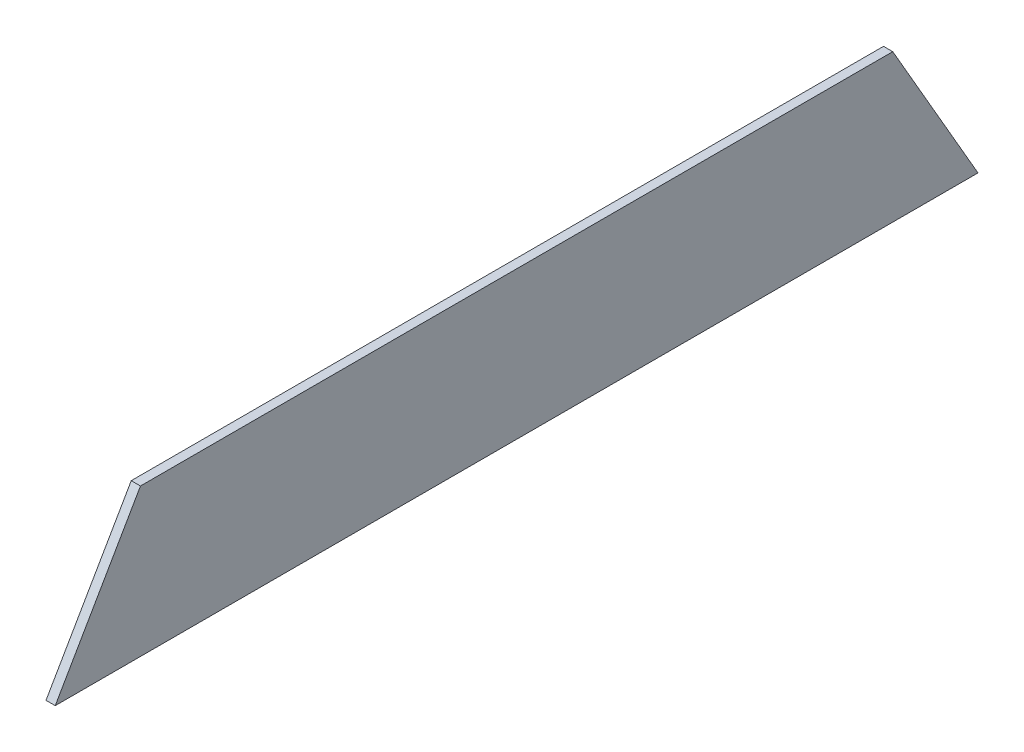
ISO-10303-21;
HEADER;
FILE_DESCRIPTION(('STEP AP214'),'2;1');
FILE_NAME('part.step','',(''),(''),'','','');
FILE_SCHEMA(('AUTOMOTIVE_DESIGN { 1 0 10303 214 1 1 1 1 }'));
ENDSEC;
DATA;
#1=APPLICATION_CONTEXT('core data for automotive mechanical design processes');
#2=APPLICATION_PROTOCOL_DEFINITION('international standard','automotive_design',2000,#1);
#3=PRODUCT_CONTEXT('',#1,'mechanical');
#4=PRODUCT('Part','Part','',(#3));
#5=PRODUCT_RELATED_PRODUCT_CATEGORY('part','',(#4));
#6=PRODUCT_DEFINITION_FORMATION('','',#4);
#7=PRODUCT_DEFINITION_CONTEXT('part definition',#1,'design');
#8=PRODUCT_DEFINITION('design','',#6,#7);
#9=PRODUCT_DEFINITION_SHAPE('','',#8);
#10=(LENGTH_UNIT() NAMED_UNIT(*) SI_UNIT(.MILLI.,.METRE.));
#11=(NAMED_UNIT(*) PLANE_ANGLE_UNIT() SI_UNIT($,.RADIAN.));
#12=(NAMED_UNIT(*) SI_UNIT($,.STERADIAN.) SOLID_ANGLE_UNIT());
#13=UNCERTAINTY_MEASURE_WITH_UNIT(LENGTH_MEASURE(1.E-05),#10,'distance_accuracy_value','');
#14=(GEOMETRIC_REPRESENTATION_CONTEXT(3) GLOBAL_UNCERTAINTY_ASSIGNED_CONTEXT((#13)) GLOBAL_UNIT_ASSIGNED_CONTEXT((#10,
#11,#12)) REPRESENTATION_CONTEXT('',''));
#15=CARTESIAN_POINT('',(0.,0.,0.));
#16=DIRECTION('',(0.,0.,1.));
#17=DIRECTION('',(1.,0.,0.));
#18=AXIS2_PLACEMENT_3D('',#15,#16,#17);
#19=CARTESIAN_POINT('',(1.5875,0.,0.));
#20=DIRECTION('',(0.,-0.499999999999998,0.86602540378444));
#21=DIRECTION('',(0.,-0.86602540378444,-0.499999999999998));
#22=AXIS2_PLACEMENT_3D('',#19,#20,#21);
#23=PLANE('',#22);
#24=DIRECTION('',(0.,0.86602540378444,0.499999999999998));
#25=VECTOR('',#24,1.);
#26=CARTESIAN_POINT('',(0.,0.,0.));
#27=LINE('',#26,#25);
#28=CARTESIAN_POINT('',(0.,0.,0.));
#29=VERTEX_POINT('',#28);
#30=CARTESIAN_POINT('',(0.,25.4,14.6646968374164));
#31=VERTEX_POINT('',#30);
#32=EDGE_CURVE('E100',#29,#31,#27,.T.);
#33=ORIENTED_EDGE('',*,*,#32,.T.);
#34=DIRECTION('',(-1.,0.,0.));
#35=VECTOR('',#34,1.);
#36=CARTESIAN_POINT('',(1.5875,25.4,14.6646968374164));
#37=LINE('',#36,#35);
#38=CARTESIAN_POINT('',(1.5875,25.4,14.6646968374164));
#39=VERTEX_POINT('',#38);
#40=EDGE_CURVE('E11',#39,#31,#37,.T.);
#41=ORIENTED_EDGE('',*,*,#40,.F.);
#42=DIRECTION('',(0.,0.86602540378444,0.499999999999998));
#43=VECTOR('',#42,1.);
#44=CARTESIAN_POINT('',(1.5875,0.,0.));
#45=LINE('',#44,#43);
#46=CARTESIAN_POINT('',(1.5875,0.,0.));
#47=VERTEX_POINT('',#46);
#48=EDGE_CURVE('E88',#47,#39,#45,.T.);
#49=ORIENTED_EDGE('',*,*,#48,.F.);
#50=DIRECTION('',(-1.,0.,0.));
#51=VECTOR('',#50,1.);
#52=CARTESIAN_POINT('',(1.5875,0.,0.));
#53=LINE('',#52,#51);
#54=EDGE_CURVE('E96',#47,#29,#53,.T.);
#55=ORIENTED_EDGE('',*,*,#54,.T.);
#56=EDGE_LOOP('',(#33,#41,#49,#55));
#57=FACE_BOUND('',#56,.T.);
#58=ADVANCED_FACE('F37',(#57),#23,.F.);
#59=CARTESIAN_POINT('',(1.5875,25.4,14.6646968374164));
#60=DIRECTION('',(0.,-1.,0.));
#61=DIRECTION('',(0.,0.,-1.));
#62=AXIS2_PLACEMENT_3D('',#59,#60,#61);
#63=PLANE('',#62);
#64=DIRECTION('',(0.,0.,1.));
#65=VECTOR('',#64,1.);
#66=CARTESIAN_POINT('',(0.,25.4,14.6646968374164));
#67=LINE('',#66,#65);
#68=CARTESIAN_POINT('',(0.,25.4,144.085303162583));
#69=VERTEX_POINT('',#68);
#70=EDGE_CURVE('E92',#31,#69,#67,.T.);
#71=ORIENTED_EDGE('',*,*,#70,.T.);
#72=DIRECTION('',(-1.,0.,0.));
#73=VECTOR('',#72,1.);
#74=CARTESIAN_POINT('',(1.5875,25.4,144.085303162583));
#75=LINE('',#74,#73);
#76=CARTESIAN_POINT('',(1.5875,25.4,144.085303162583));
#77=VERTEX_POINT('',#76);
#78=EDGE_CURVE('E45',#77,#69,#75,.T.);
#79=ORIENTED_EDGE('',*,*,#78,.F.);
#80=DIRECTION('',(0.,0.,1.));
#81=VECTOR('',#80,1.);
#82=CARTESIAN_POINT('',(1.5875,25.4,14.6646968374164));
#83=LINE('',#82,#81);
#84=EDGE_CURVE('E83',#39,#77,#83,.T.);
#85=ORIENTED_EDGE('',*,*,#84,.F.);
#86=ORIENTED_EDGE('',*,*,#40,.T.);
#87=EDGE_LOOP('',(#71,#79,#85,#86));
#88=FACE_BOUND('',#87,.T.);
#89=ADVANCED_FACE('F91',(#88),#63,.F.);
#90=CARTESIAN_POINT('',(1.5875,0.,158.75));
#91=DIRECTION('',(0.,-0.500000000000004,-0.866025403784436));
#92=DIRECTION('',(0.,0.866025403784436,-0.500000000000004));
#93=AXIS2_PLACEMENT_3D('',#90,#91,#92);
#94=PLANE('',#93);
#95=DIRECTION('',(0.,-0.866025403784436,0.500000000000004));
#96=VECTOR('',#95,1.);
#97=CARTESIAN_POINT('',(0.,0.,158.75));
#98=LINE('',#97,#96);
#99=CARTESIAN_POINT('',(0.,0.,158.75));
#100=VERTEX_POINT('',#99);
#101=EDGE_CURVE('E70',#69,#100,#98,.T.);
#102=ORIENTED_EDGE('',*,*,#101,.T.);
#103=DIRECTION('',(-1.,0.,0.));
#104=VECTOR('',#103,1.);
#105=CARTESIAN_POINT('',(1.5875,0.,158.75));
#106=LINE('',#105,#104);
#107=CARTESIAN_POINT('',(1.5875,0.,158.75));
#108=VERTEX_POINT('',#107);
#109=EDGE_CURVE('E93',#108,#100,#106,.T.);
#110=ORIENTED_EDGE('',*,*,#109,.F.);
#111=DIRECTION('',(0.,-0.866025403784436,0.500000000000004));
#112=VECTOR('',#111,1.);
#113=CARTESIAN_POINT('',(1.5875,0.,158.75));
#114=LINE('',#113,#112);
#115=EDGE_CURVE('E86',#77,#108,#114,.T.);
#116=ORIENTED_EDGE('',*,*,#115,.F.);
#117=ORIENTED_EDGE('',*,*,#78,.T.);
#118=EDGE_LOOP('',(#102,#110,#116,#117));
#119=FACE_BOUND('',#118,.T.);
#120=ADVANCED_FACE('F94',(#119),#94,.F.);
#121=CARTESIAN_POINT('',(1.5875,0.,0.));
#122=DIRECTION('',(0.,1.,0.));
#123=DIRECTION('',(0.,0.,1.));
#124=AXIS2_PLACEMENT_3D('',#121,#122,#123);
#125=PLANE('',#124);
#126=DIRECTION('',(0.,0.,-1.));
#127=VECTOR('',#126,1.);
#128=CARTESIAN_POINT('',(0.,0.,0.));
#129=LINE('',#128,#127);
#130=EDGE_CURVE('E76',#100,#29,#129,.T.);
#131=ORIENTED_EDGE('',*,*,#130,.T.);
#132=ORIENTED_EDGE('',*,*,#54,.F.);
#133=DIRECTION('',(0.,0.,-1.));
#134=VECTOR('',#133,1.);
#135=CARTESIAN_POINT('',(1.5875,0.,0.));
#136=LINE('',#135,#134);
#137=EDGE_CURVE('E53',#108,#47,#136,.T.);
#138=ORIENTED_EDGE('',*,*,#137,.F.);
#139=ORIENTED_EDGE('',*,*,#109,.T.);
#140=EDGE_LOOP('',(#131,#132,#138,#139));
#141=FACE_BOUND('',#140,.T.);
#142=ADVANCED_FACE('F107',(#141),#125,.F.);
#143=CARTESIAN_POINT('',(1.5875,0.,0.));
#144=DIRECTION('',(1.,0.,0.));
#145=DIRECTION('',(0.,0.,-1.));
#146=AXIS2_PLACEMENT_3D('',#143,#144,#145);
#147=PLANE('',#146);
#148=ORIENTED_EDGE('',*,*,#48,.T.);
#149=ORIENTED_EDGE('',*,*,#84,.T.);
#150=ORIENTED_EDGE('',*,*,#115,.T.);
#151=ORIENTED_EDGE('',*,*,#137,.T.);
#152=EDGE_LOOP('',(#148,#149,#150,#151));
#153=FACE_BOUND('',#152,.T.);
#154=ADVANCED_FACE('F84',(#153),#147,.T.);
#155=CARTESIAN_POINT('',(0.,0.,0.));
#156=DIRECTION('',(1.,0.,0.));
#157=DIRECTION('',(0.,0.,-1.));
#158=AXIS2_PLACEMENT_3D('',#155,#156,#157);
#159=PLANE('',#158);
#160=ORIENTED_EDGE('',*,*,#32,.F.);
#161=ORIENTED_EDGE('',*,*,#130,.F.);
#162=ORIENTED_EDGE('',*,*,#101,.F.);
#163=ORIENTED_EDGE('',*,*,#70,.F.);
#164=EDGE_LOOP('',(#160,#161,#162,#163));
#165=FACE_BOUND('',#164,.T.);
#166=ADVANCED_FACE('F110',(#165),#159,.F.);
#167=CLOSED_SHELL('',(#58,#89,#120,#142,#154,#166));
#168=MANIFOLD_SOLID_BREP('B2',#167);
#169=ADVANCED_BREP_SHAPE_REPRESENTATION('',(#18,#168),#14);
#170=SHAPE_DEFINITION_REPRESENTATION(#9,#169);
ENDSEC;
END-ISO-10303-21;
